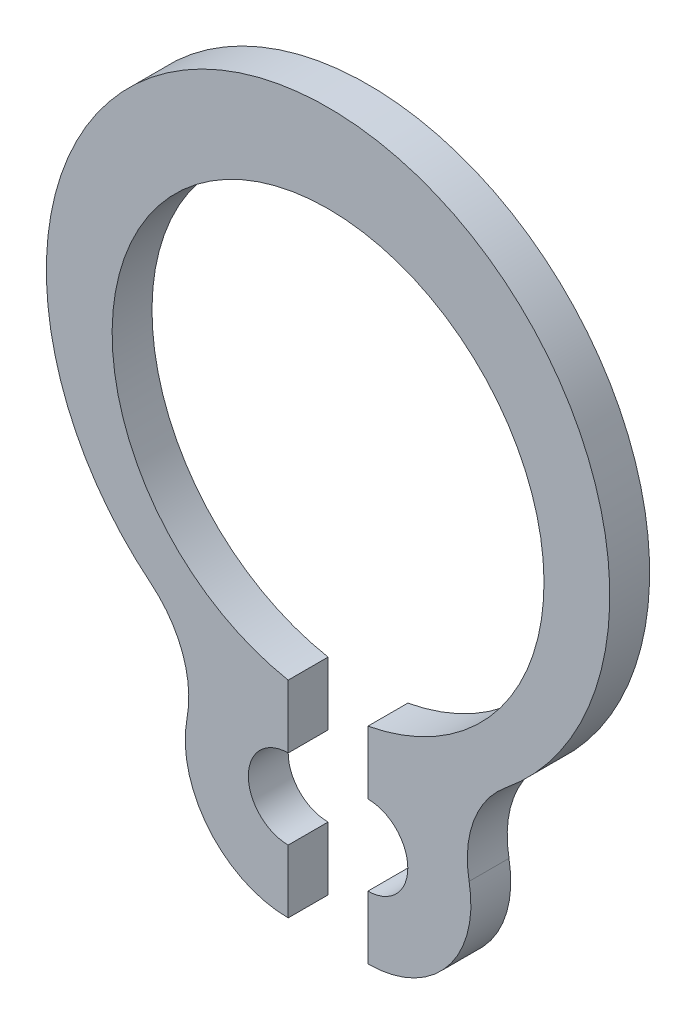
ISO-10303-21;
HEADER;
FILE_DESCRIPTION(('STEP AP214'),'2;1');
FILE_NAME('part.step','',(''),(''),'','','');
FILE_SCHEMA(('AUTOMOTIVE_DESIGN { 1 0 10303 214 1 1 1 1 }'));
ENDSEC;
DATA;
#1=APPLICATION_CONTEXT('core data for automotive mechanical design processes');
#2=APPLICATION_PROTOCOL_DEFINITION('international standard','automotive_design',2000,#1);
#3=PRODUCT_CONTEXT('',#1,'mechanical');
#4=PRODUCT('Part','Part','',(#3));
#5=PRODUCT_RELATED_PRODUCT_CATEGORY('part','',(#4));
#6=PRODUCT_DEFINITION_FORMATION('','',#4);
#7=PRODUCT_DEFINITION_CONTEXT('part definition',#1,'design');
#8=PRODUCT_DEFINITION('design','',#6,#7);
#9=PRODUCT_DEFINITION_SHAPE('','',#8);
#10=(LENGTH_UNIT() NAMED_UNIT(*) SI_UNIT(.MILLI.,.METRE.));
#11=(NAMED_UNIT(*) PLANE_ANGLE_UNIT() SI_UNIT($,.RADIAN.));
#12=(NAMED_UNIT(*) SI_UNIT($,.STERADIAN.) SOLID_ANGLE_UNIT());
#13=UNCERTAINTY_MEASURE_WITH_UNIT(LENGTH_MEASURE(1.E-05),#10,'distance_accuracy_value','');
#14=(GEOMETRIC_REPRESENTATION_CONTEXT(3) GLOBAL_UNCERTAINTY_ASSIGNED_CONTEXT((#13)) GLOBAL_UNIT_ASSIGNED_CONTEXT((#10,
#11,#12)) REPRESENTATION_CONTEXT('',''));
#15=CARTESIAN_POINT('',(0.,0.,0.));
#16=DIRECTION('',(0.,0.,1.));
#17=DIRECTION('',(1.,0.,0.));
#18=AXIS2_PLACEMENT_3D('',#15,#16,#17);
#19=CARTESIAN_POINT('',(-0.6,-5.07413525073689,-0.6));
#20=DIRECTION('',(0.,0.,1.));
#21=DIRECTION('',(1.,0.,0.));
#22=AXIS2_PLACEMENT_3D('',#19,#20,#21);
#23=CYLINDRICAL_SURFACE('',#22,0.6);
#24=CARTESIAN_POINT('',(-0.6,-5.07413525073689,0.));
#25=DIRECTION('',(0.,0.,-1.));
#26=DIRECTION('',(1.,0.,0.));
#27=AXIS2_PLACEMENT_3D('',#24,#25,#26);
#28=CIRCLE('',#27,0.6);
#29=CARTESIAN_POINT('',(-0.6,-5.67413525073689,0.));
#30=VERTEX_POINT('',#29);
#31=CARTESIAN_POINT('',(-0.6,-4.47413525073689,0.));
#32=VERTEX_POINT('',#31);
#33=EDGE_CURVE('E154',#30,#32,#28,.T.);
#34=ORIENTED_EDGE('',*,*,#33,.F.);
#35=DIRECTION('',(0.,0.,1.));
#36=VECTOR('',#35,1.);
#37=CARTESIAN_POINT('',(-0.6,-5.67413525073689,-0.6));
#38=LINE('',#37,#36);
#39=CARTESIAN_POINT('',(-0.6,-5.67413525073689,-0.6));
#40=VERTEX_POINT('',#39);
#41=EDGE_CURVE('E11',#40,#30,#38,.T.);
#42=ORIENTED_EDGE('',*,*,#41,.F.);
#43=CARTESIAN_POINT('',(-0.6,-5.07413525073689,-0.6));
#44=DIRECTION('',(0.,0.,-1.));
#45=DIRECTION('',(1.,0.,0.));
#46=AXIS2_PLACEMENT_3D('',#43,#44,#45);
#47=CIRCLE('',#46,0.6);
#48=CARTESIAN_POINT('',(-0.6,-4.47413525073689,-0.6));
#49=VERTEX_POINT('',#48);
#50=EDGE_CURVE('E186',#40,#49,#47,.T.);
#51=ORIENTED_EDGE('',*,*,#50,.T.);
#52=DIRECTION('',(0.,0.,1.));
#53=VECTOR('',#52,1.);
#54=CARTESIAN_POINT('',(-0.6,-4.47413525073689,-0.6));
#55=LINE('',#54,#53);
#56=EDGE_CURVE('E36',#49,#32,#55,.T.);
#57=ORIENTED_EDGE('',*,*,#56,.T.);
#58=EDGE_LOOP('',(#34,#42,#51,#57));
#59=FACE_BOUND('',#58,.T.);
#60=ADVANCED_FACE('F33',(#59),#23,.F.);
#61=CARTESIAN_POINT('',(-0.6,-5.67413525073689,-0.6));
#62=DIRECTION('',(1.,0.,0.));
#63=DIRECTION('',(0.,1.,0.));
#64=AXIS2_PLACEMENT_3D('',#61,#62,#63);
#65=PLANE('',#64);
#66=DIRECTION('',(0.,1.,0.));
#67=VECTOR('',#66,1.);
#68=CARTESIAN_POINT('',(-0.6,-5.67413525073689,0.));
#69=LINE('',#68,#67);
#70=CARTESIAN_POINT('',(-0.599999999999999,-6.62413525073689,0.));
#71=VERTEX_POINT('',#70);
#72=EDGE_CURVE('E184',#71,#30,#69,.T.);
#73=ORIENTED_EDGE('',*,*,#72,.F.);
#74=DIRECTION('',(0.,0.,1.));
#75=VECTOR('',#74,1.);
#76=CARTESIAN_POINT('',(-0.599999999999999,-6.62413525073689,-0.6));
#77=LINE('',#76,#75);
#78=CARTESIAN_POINT('',(-0.599999999999999,-6.62413525073689,-0.6));
#79=VERTEX_POINT('',#78);
#80=EDGE_CURVE('E42',#79,#71,#77,.T.);
#81=ORIENTED_EDGE('',*,*,#80,.F.);
#82=DIRECTION('',(0.,1.,0.));
#83=VECTOR('',#82,1.);
#84=CARTESIAN_POINT('',(-0.6,-5.67413525073689,-0.6));
#85=LINE('',#84,#83);
#86=EDGE_CURVE('E144',#79,#40,#85,.T.);
#87=ORIENTED_EDGE('',*,*,#86,.T.);
#88=ORIENTED_EDGE('',*,*,#41,.T.);
#89=EDGE_LOOP('',(#73,#81,#87,#88));
#90=FACE_BOUND('',#89,.T.);
#91=ADVANCED_FACE('F206',(#90),#65,.T.);
#92=CARTESIAN_POINT('',(-0.6,-5.07413525073689,-0.6));
#93=DIRECTION('',(0.,0.,1.));
#94=DIRECTION('',(1.,0.,0.));
#95=AXIS2_PLACEMENT_3D('',#92,#93,#94);
#96=CYLINDRICAL_SURFACE('',#95,1.55);
#97=CARTESIAN_POINT('',(-0.6,-5.07413525073689,0.));
#98=DIRECTION('',(0.,0.,1.));
#99=DIRECTION('',(-1.,0.,0.));
#100=AXIS2_PLACEMENT_3D('',#97,#98,#99);
#101=CIRCLE('',#100,1.55);
#102=CARTESIAN_POINT('',(-2.12298547480196,-4.78601159057991,0.));
#103=VERTEX_POINT('',#102);
#104=EDGE_CURVE('E131',#103,#71,#101,.T.);
#105=ORIENTED_EDGE('',*,*,#104,.F.);
#106=DIRECTION('',(0.,0.,1.));
#107=VECTOR('',#106,1.);
#108=CARTESIAN_POINT('',(-2.12298547480196,-4.78601159057991,-0.6));
#109=LINE('',#108,#107);
#110=CARTESIAN_POINT('',(-2.12298547480196,-4.78601159057991,-0.6));
#111=VERTEX_POINT('',#110);
#112=EDGE_CURVE('E126',#111,#103,#109,.T.);
#113=ORIENTED_EDGE('',*,*,#112,.F.);
#114=CARTESIAN_POINT('',(-0.6,-5.07413525073689,-0.6));
#115=DIRECTION('',(0.,0.,1.));
#116=DIRECTION('',(-1.,0.,0.));
#117=AXIS2_PLACEMENT_3D('',#114,#115,#116);
#118=CIRCLE('',#117,1.55);
#119=EDGE_CURVE('E129',#111,#79,#118,.T.);
#120=ORIENTED_EDGE('',*,*,#119,.T.);
#121=ORIENTED_EDGE('',*,*,#80,.T.);
#122=EDGE_LOOP('',(#105,#113,#120,#121));
#123=FACE_BOUND('',#122,.T.);
#124=ADVANCED_FACE('F128',(#123),#96,.T.);
#125=CARTESIAN_POINT('',(-3.64597094960392,-4.49788793042294,-0.6));
#126=DIRECTION('',(0.,0.,1.));
#127=DIRECTION('',(1.,0.,0.));
#128=AXIS2_PLACEMENT_3D('',#125,#126,#127);
#129=CYLINDRICAL_SURFACE('',#128,1.55);
#130=CARTESIAN_POINT('',(-3.64597094960392,-4.49788793042294,0.));
#131=DIRECTION('',(0.,0.,-1.));
#132=DIRECTION('',(-1.,0.,0.));
#133=AXIS2_PLACEMENT_3D('',#130,#131,#132);
#134=CIRCLE('',#133,1.55);
#135=CARTESIAN_POINT('',(-2.66993382147161,-3.29379012521472,0.));
#136=VERTEX_POINT('',#135);
#137=EDGE_CURVE('E181',#136,#103,#134,.T.);
#138=ORIENTED_EDGE('',*,*,#137,.F.);
#139=DIRECTION('',(0.,0.,1.));
#140=VECTOR('',#139,1.);
#141=CARTESIAN_POINT('',(-2.66993382147161,-3.29379012521472,-0.6));
#142=LINE('',#141,#140);
#143=CARTESIAN_POINT('',(-2.66993382147161,-3.29379012521472,-0.6));
#144=VERTEX_POINT('',#143);
#145=EDGE_CURVE('E136',#144,#136,#142,.T.);
#146=ORIENTED_EDGE('',*,*,#145,.F.);
#147=CARTESIAN_POINT('',(-3.64597094960392,-4.49788793042294,-0.6));
#148=DIRECTION('',(0.,0.,-1.));
#149=DIRECTION('',(-1.,0.,0.));
#150=AXIS2_PLACEMENT_3D('',#147,#148,#149);
#151=CIRCLE('',#150,1.55);
#152=EDGE_CURVE('E142',#144,#111,#151,.T.);
#153=ORIENTED_EDGE('',*,*,#152,.T.);
#154=ORIENTED_EDGE('',*,*,#112,.T.);
#155=EDGE_LOOP('',(#138,#146,#153,#154));
#156=FACE_BOUND('',#155,.T.);
#157=ADVANCED_FACE('F146',(#156),#129,.F.);
#158=CARTESIAN_POINT('',(0.,0.,-0.6));
#159=DIRECTION('',(0.,0.,1.));
#160=DIRECTION('',(1.,0.,0.));
#161=AXIS2_PLACEMENT_3D('',#158,#159,#160);
#162=CYLINDRICAL_SURFACE('',#161,4.24);
#163=CARTESIAN_POINT('',(0.,0.,0.));
#164=DIRECTION('',(0.,0.,1.));
#165=DIRECTION('',(1.,0.,0.));
#166=AXIS2_PLACEMENT_3D('',#163,#164,#165);
#167=CIRCLE('',#166,4.24);
#168=CARTESIAN_POINT('',(2.66993382147161,-3.29379012521472,0.));
#169=VERTEX_POINT('',#168);
#170=EDGE_CURVE('E178',#169,#136,#167,.T.);
#171=ORIENTED_EDGE('',*,*,#170,.F.);
#172=DIRECTION('',(0.,0.,1.));
#173=VECTOR('',#172,1.);
#174=CARTESIAN_POINT('',(2.66993382147161,-3.29379012521472,-0.6));
#175=LINE('',#174,#173);
#176=CARTESIAN_POINT('',(2.66993382147161,-3.29379012521472,-0.6));
#177=VERTEX_POINT('',#176);
#178=EDGE_CURVE('E190',#177,#169,#175,.T.);
#179=ORIENTED_EDGE('',*,*,#178,.F.);
#180=CARTESIAN_POINT('',(0.,0.,-0.6));
#181=DIRECTION('',(0.,0.,1.));
#182=DIRECTION('',(1.,0.,0.));
#183=AXIS2_PLACEMENT_3D('',#180,#181,#182);
#184=CIRCLE('',#183,4.24);
#185=EDGE_CURVE('E147',#177,#144,#184,.T.);
#186=ORIENTED_EDGE('',*,*,#185,.T.);
#187=ORIENTED_EDGE('',*,*,#145,.T.);
#188=EDGE_LOOP('',(#171,#179,#186,#187));
#189=FACE_BOUND('',#188,.T.);
#190=ADVANCED_FACE('F219',(#189),#162,.T.);
#191=CARTESIAN_POINT('',(3.64597094960392,-4.49788793042293,-0.6));
#192=DIRECTION('',(0.,0.,1.));
#193=DIRECTION('',(1.,0.,0.));
#194=AXIS2_PLACEMENT_3D('',#191,#192,#193);
#195=CYLINDRICAL_SURFACE('',#194,1.55);
#196=CARTESIAN_POINT('',(3.64597094960392,-4.49788793042293,0.));
#197=DIRECTION('',(0.,0.,-1.));
#198=DIRECTION('',(1.,0.,0.));
#199=AXIS2_PLACEMENT_3D('',#196,#197,#198);
#200=CIRCLE('',#199,1.55);
#201=CARTESIAN_POINT('',(2.12298547480196,-4.78601159057991,0.));
#202=VERTEX_POINT('',#201);
#203=EDGE_CURVE('E175',#202,#169,#200,.T.);
#204=ORIENTED_EDGE('',*,*,#203,.F.);
#205=DIRECTION('',(0.,0.,1.));
#206=VECTOR('',#205,1.);
#207=CARTESIAN_POINT('',(2.12298547480196,-4.78601159057991,-0.6));
#208=LINE('',#207,#206);
#209=CARTESIAN_POINT('',(2.12298547480196,-4.78601159057991,-0.6));
#210=VERTEX_POINT('',#209);
#211=EDGE_CURVE('E192',#210,#202,#208,.T.);
#212=ORIENTED_EDGE('',*,*,#211,.F.);
#213=CARTESIAN_POINT('',(3.64597094960392,-4.49788793042293,-0.6));
#214=DIRECTION('',(0.,0.,-1.));
#215=DIRECTION('',(1.,0.,0.));
#216=AXIS2_PLACEMENT_3D('',#213,#214,#215);
#217=CIRCLE('',#216,1.55);
#218=EDGE_CURVE('E149',#210,#177,#217,.T.);
#219=ORIENTED_EDGE('',*,*,#218,.T.);
#220=ORIENTED_EDGE('',*,*,#178,.T.);
#221=EDGE_LOOP('',(#204,#212,#219,#220));
#222=FACE_BOUND('',#221,.T.);
#223=ADVANCED_FACE('F222',(#222),#195,.F.);
#224=CARTESIAN_POINT('',(0.600000000000001,-5.07413525073689,-0.6));
#225=DIRECTION('',(0.,0.,1.));
#226=DIRECTION('',(1.,0.,0.));
#227=AXIS2_PLACEMENT_3D('',#224,#225,#226);
#228=CYLINDRICAL_SURFACE('',#227,1.55);
#229=CARTESIAN_POINT('',(0.600000000000001,-5.07413525073689,0.));
#230=DIRECTION('',(0.,0.,1.));
#231=DIRECTION('',(1.,0.,0.));
#232=AXIS2_PLACEMENT_3D('',#229,#230,#231);
#233=CIRCLE('',#232,1.55);
#234=CARTESIAN_POINT('',(0.600000000000001,-6.62413525073689,0.));
#235=VERTEX_POINT('',#234);
#236=EDGE_CURVE('E172',#235,#202,#233,.T.);
#237=ORIENTED_EDGE('',*,*,#236,.F.);
#238=DIRECTION('',(0.,0.,1.));
#239=VECTOR('',#238,1.);
#240=CARTESIAN_POINT('',(0.600000000000001,-6.62413525073689,-0.6));
#241=LINE('',#240,#239);
#242=CARTESIAN_POINT('',(0.600000000000001,-6.62413525073689,-0.6));
#243=VERTEX_POINT('',#242);
#244=EDGE_CURVE('E194',#243,#235,#241,.T.);
#245=ORIENTED_EDGE('',*,*,#244,.F.);
#246=CARTESIAN_POINT('',(0.600000000000001,-5.07413525073689,-0.6));
#247=DIRECTION('',(0.,0.,1.));
#248=DIRECTION('',(1.,0.,0.));
#249=AXIS2_PLACEMENT_3D('',#246,#247,#248);
#250=CIRCLE('',#249,1.55);
#251=EDGE_CURVE('E348',#243,#210,#250,.T.);
#252=ORIENTED_EDGE('',*,*,#251,.T.);
#253=ORIENTED_EDGE('',*,*,#211,.T.);
#254=EDGE_LOOP('',(#237,#245,#252,#253));
#255=FACE_BOUND('',#254,.T.);
#256=ADVANCED_FACE('F226',(#255),#228,.T.);
#257=CARTESIAN_POINT('',(0.600000000000001,-5.67413525073689,-0.6));
#258=DIRECTION('',(-1.,0.,0.));
#259=DIRECTION('',(0.,-1.,0.));
#260=AXIS2_PLACEMENT_3D('',#257,#258,#259);
#261=PLANE('',#260);
#262=DIRECTION('',(0.,-1.,0.));
#263=VECTOR('',#262,1.);
#264=CARTESIAN_POINT('',(0.600000000000001,-5.67413525073689,0.));
#265=LINE('',#264,#263);
#266=CARTESIAN_POINT('',(0.600000000000001,-5.67413525073689,0.));
#267=VERTEX_POINT('',#266);
#268=EDGE_CURVE('E169',#267,#235,#265,.T.);
#269=ORIENTED_EDGE('',*,*,#268,.F.);
#270=DIRECTION('',(0.,0.,1.));
#271=VECTOR('',#270,1.);
#272=CARTESIAN_POINT('',(0.600000000000001,-5.67413525073689,-0.6));
#273=LINE('',#272,#271);
#274=CARTESIAN_POINT('',(0.600000000000001,-5.67413525073689,-0.6));
#275=VERTEX_POINT('',#274);
#276=EDGE_CURVE('E196',#275,#267,#273,.T.);
#277=ORIENTED_EDGE('',*,*,#276,.F.);
#278=DIRECTION('',(0.,-1.,0.));
#279=VECTOR('',#278,1.);
#280=CARTESIAN_POINT('',(0.600000000000001,-5.67413525073689,-0.6));
#281=LINE('',#280,#279);
#282=EDGE_CURVE('E352',#275,#243,#281,.T.);
#283=ORIENTED_EDGE('',*,*,#282,.T.);
#284=ORIENTED_EDGE('',*,*,#244,.T.);
#285=EDGE_LOOP('',(#269,#277,#283,#284));
#286=FACE_BOUND('',#285,.T.);
#287=ADVANCED_FACE('F230',(#286),#261,.T.);
#288=CARTESIAN_POINT('',(0.600000000000001,-5.07413525073689,-0.6));
#289=DIRECTION('',(0.,0.,1.));
#290=DIRECTION('',(1.,0.,0.));
#291=AXIS2_PLACEMENT_3D('',#288,#289,#290);
#292=CYLINDRICAL_SURFACE('',#291,0.6);
#293=CARTESIAN_POINT('',(0.600000000000001,-5.07413525073689,0.));
#294=DIRECTION('',(0.,0.,-1.));
#295=DIRECTION('',(-1.,0.,0.));
#296=AXIS2_PLACEMENT_3D('',#293,#294,#295);
#297=CIRCLE('',#296,0.6);
#298=CARTESIAN_POINT('',(0.600000000000001,-4.47413525073689,0.));
#299=VERTEX_POINT('',#298);
#300=EDGE_CURVE('E166',#299,#267,#297,.T.);
#301=ORIENTED_EDGE('',*,*,#300,.F.);
#302=DIRECTION('',(0.,0.,1.));
#303=VECTOR('',#302,1.);
#304=CARTESIAN_POINT('',(0.600000000000001,-4.47413525073689,-0.6));
#305=LINE('',#304,#303);
#306=CARTESIAN_POINT('',(0.600000000000001,-4.47413525073689,-0.6));
#307=VERTEX_POINT('',#306);
#308=EDGE_CURVE('E198',#307,#299,#305,.T.);
#309=ORIENTED_EDGE('',*,*,#308,.F.);
#310=CARTESIAN_POINT('',(0.600000000000001,-5.07413525073689,-0.6));
#311=DIRECTION('',(0.,0.,-1.));
#312=DIRECTION('',(-1.,0.,0.));
#313=AXIS2_PLACEMENT_3D('',#310,#311,#312);
#314=CIRCLE('',#313,0.6);
#315=EDGE_CURVE('E341',#307,#275,#314,.T.);
#316=ORIENTED_EDGE('',*,*,#315,.T.);
#317=ORIENTED_EDGE('',*,*,#276,.T.);
#318=EDGE_LOOP('',(#301,#309,#316,#317));
#319=FACE_BOUND('',#318,.T.);
#320=ADVANCED_FACE('F234',(#319),#292,.F.);
#321=CARTESIAN_POINT('',(0.6,-3.52413525073689,-0.6));
#322=DIRECTION('',(-1.,0.,0.));
#323=DIRECTION('',(0.,-1.,0.));
#324=AXIS2_PLACEMENT_3D('',#321,#322,#323);
#325=PLANE('',#324);
#326=DIRECTION('',(0.,-1.,0.));
#327=VECTOR('',#326,1.);
#328=CARTESIAN_POINT('',(0.6,-3.52413525073689,0.));
#329=LINE('',#328,#327);
#330=CARTESIAN_POINT('',(0.599999999999999,-3.52413525073689,0.));
#331=VERTEX_POINT('',#330);
#332=EDGE_CURVE('E163',#331,#299,#329,.T.);
#333=ORIENTED_EDGE('',*,*,#332,.F.);
#334=DIRECTION('',(0.,0.,1.));
#335=VECTOR('',#334,1.);
#336=CARTESIAN_POINT('',(0.599999999999999,-3.52413525073689,-0.6));
#337=LINE('',#336,#335);
#338=CARTESIAN_POINT('',(0.599999999999999,-3.52413525073689,-0.6));
#339=VERTEX_POINT('',#338);
#340=EDGE_CURVE('E200',#339,#331,#337,.T.);
#341=ORIENTED_EDGE('',*,*,#340,.F.);
#342=DIRECTION('',(0.,-1.,0.));
#343=VECTOR('',#342,1.);
#344=CARTESIAN_POINT('',(0.6,-3.52413525073689,-0.6));
#345=LINE('',#344,#343);
#346=EDGE_CURVE('E337',#339,#307,#345,.T.);
#347=ORIENTED_EDGE('',*,*,#346,.T.);
#348=ORIENTED_EDGE('',*,*,#308,.T.);
#349=EDGE_LOOP('',(#333,#341,#347,#348));
#350=FACE_BOUND('',#349,.T.);
#351=ADVANCED_FACE('F238',(#350),#325,.T.);
#352=CARTESIAN_POINT('',(0.,-0.33,-0.6));
#353=DIRECTION('',(0.,0.,1.));
#354=DIRECTION('',(1.,0.,0.));
#355=AXIS2_PLACEMENT_3D('',#352,#353,#354);
#356=CYLINDRICAL_SURFACE('',#355,3.25);
#357=CARTESIAN_POINT('',(0.,-0.33,0.));
#358=DIRECTION('',(0.,0.,-1.));
#359=DIRECTION('',(1.,0.,0.));
#360=AXIS2_PLACEMENT_3D('',#357,#358,#359);
#361=CIRCLE('',#360,3.25);
#362=CARTESIAN_POINT('',(-0.6,-3.52413525073689,0.));
#363=VERTEX_POINT('',#362);
#364=EDGE_CURVE('E160',#363,#331,#361,.T.);
#365=ORIENTED_EDGE('',*,*,#364,.F.);
#366=DIRECTION('',(0.,0.,1.));
#367=VECTOR('',#366,1.);
#368=CARTESIAN_POINT('',(-0.6,-3.52413525073689,-0.6));
#369=LINE('',#368,#367);
#370=CARTESIAN_POINT('',(-0.6,-3.52413525073689,-0.6));
#371=VERTEX_POINT('',#370);
#372=EDGE_CURVE('E201',#371,#363,#369,.T.);
#373=ORIENTED_EDGE('',*,*,#372,.F.);
#374=CARTESIAN_POINT('',(0.,-0.33,-0.6));
#375=DIRECTION('',(0.,0.,-1.));
#376=DIRECTION('',(1.,0.,0.));
#377=AXIS2_PLACEMENT_3D('',#374,#375,#376);
#378=CIRCLE('',#377,3.25);
#379=EDGE_CURVE('E358',#371,#339,#378,.T.);
#380=ORIENTED_EDGE('',*,*,#379,.T.);
#381=ORIENTED_EDGE('',*,*,#340,.T.);
#382=EDGE_LOOP('',(#365,#373,#380,#381));
#383=FACE_BOUND('',#382,.T.);
#384=ADVANCED_FACE('F242',(#383),#356,.F.);
#385=CARTESIAN_POINT('',(-0.6,-3.52413525073689,-0.6));
#386=DIRECTION('',(1.,0.,0.));
#387=DIRECTION('',(0.,1.,0.));
#388=AXIS2_PLACEMENT_3D('',#385,#386,#387);
#389=PLANE('',#388);
#390=DIRECTION('',(0.,1.,0.));
#391=VECTOR('',#390,1.);
#392=CARTESIAN_POINT('',(-0.6,-3.52413525073689,0.));
#393=LINE('',#392,#391);
#394=EDGE_CURVE('E157',#32,#363,#393,.T.);
#395=ORIENTED_EDGE('',*,*,#394,.F.);
#396=ORIENTED_EDGE('',*,*,#56,.F.);
#397=DIRECTION('',(0.,1.,0.));
#398=VECTOR('',#397,1.);
#399=CARTESIAN_POINT('',(-0.6,-3.52413525073689,-0.6));
#400=LINE('',#399,#398);
#401=EDGE_CURVE('E360',#49,#371,#400,.T.);
#402=ORIENTED_EDGE('',*,*,#401,.T.);
#403=ORIENTED_EDGE('',*,*,#372,.T.);
#404=EDGE_LOOP('',(#395,#396,#402,#403));
#405=FACE_BOUND('',#404,.T.);
#406=ADVANCED_FACE('F203',(#405),#389,.T.);
#407=CARTESIAN_POINT('',(-0.6,-5.07413525073689,-0.6));
#408=DIRECTION('',(0.,0.,1.));
#409=DIRECTION('',(1.,0.,0.));
#410=AXIS2_PLACEMENT_3D('',#407,#408,#409);
#411=PLANE('',#410);
#412=ORIENTED_EDGE('',*,*,#50,.F.);
#413=ORIENTED_EDGE('',*,*,#86,.F.);
#414=ORIENTED_EDGE('',*,*,#119,.F.);
#415=ORIENTED_EDGE('',*,*,#152,.F.);
#416=ORIENTED_EDGE('',*,*,#185,.F.);
#417=ORIENTED_EDGE('',*,*,#218,.F.);
#418=ORIENTED_EDGE('',*,*,#251,.F.);
#419=ORIENTED_EDGE('',*,*,#282,.F.);
#420=ORIENTED_EDGE('',*,*,#315,.F.);
#421=ORIENTED_EDGE('',*,*,#346,.F.);
#422=ORIENTED_EDGE('',*,*,#379,.F.);
#423=ORIENTED_EDGE('',*,*,#401,.F.);
#424=EDGE_LOOP('',(#412,#413,#414,#415,#416,#417,#418,#419,#420,#421,#422,#423));
#425=FACE_BOUND('',#424,.T.);
#426=ADVANCED_FACE('F140',(#425),#411,.F.);
#427=CARTESIAN_POINT('',(-0.6,-5.07413525073689,0.));
#428=DIRECTION('',(0.,0.,1.));
#429=DIRECTION('',(1.,0.,0.));
#430=AXIS2_PLACEMENT_3D('',#427,#428,#429);
#431=PLANE('',#430);
#432=ORIENTED_EDGE('',*,*,#33,.T.);
#433=ORIENTED_EDGE('',*,*,#394,.T.);
#434=ORIENTED_EDGE('',*,*,#364,.T.);
#435=ORIENTED_EDGE('',*,*,#332,.T.);
#436=ORIENTED_EDGE('',*,*,#300,.T.);
#437=ORIENTED_EDGE('',*,*,#268,.T.);
#438=ORIENTED_EDGE('',*,*,#236,.T.);
#439=ORIENTED_EDGE('',*,*,#203,.T.);
#440=ORIENTED_EDGE('',*,*,#170,.T.);
#441=ORIENTED_EDGE('',*,*,#137,.T.);
#442=ORIENTED_EDGE('',*,*,#104,.T.);
#443=ORIENTED_EDGE('',*,*,#72,.T.);
#444=EDGE_LOOP('',(#432,#433,#434,#435,#436,#437,#438,#439,#440,#441,#442,#443));
#445=FACE_BOUND('',#444,.T.);
#446=ADVANCED_FACE('F205',(#445),#431,.T.);
#447=CLOSED_SHELL('',(#60,#91,#124,#157,#190,#223,#256,#287,#320,#351,#384,#406,#426,#446));
#448=MANIFOLD_SOLID_BREP('B2',#447);
#449=ADVANCED_BREP_SHAPE_REPRESENTATION('',(#18,#448),#14);
#450=SHAPE_DEFINITION_REPRESENTATION(#9,#449);
ENDSEC;
END-ISO-10303-21;
